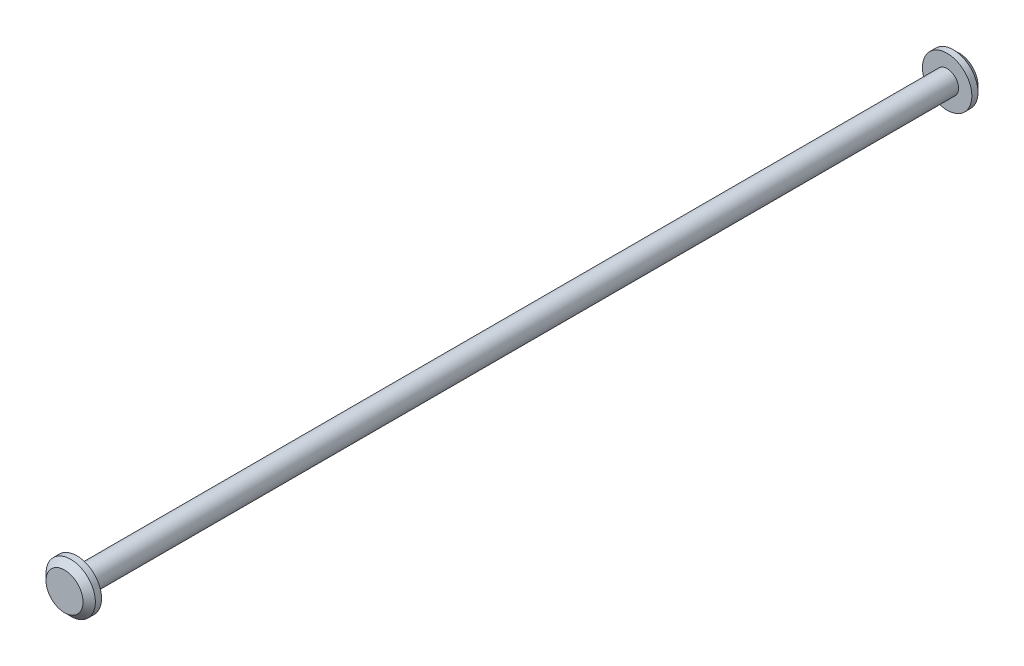
ISO-10303-21;
HEADER;
FILE_DESCRIPTION(('STEP AP214'),'2;1');
FILE_NAME('part.step','',(''),(''),'','','');
FILE_SCHEMA(('AUTOMOTIVE_DESIGN { 1 0 10303 214 1 1 1 1 }'));
ENDSEC;
DATA;
#1=APPLICATION_CONTEXT('core data for automotive mechanical design processes');
#2=APPLICATION_PROTOCOL_DEFINITION('international standard','automotive_design',2000,#1);
#3=PRODUCT_CONTEXT('',#1,'mechanical');
#4=PRODUCT('Part','Part','',(#3));
#5=PRODUCT_RELATED_PRODUCT_CATEGORY('part','',(#4));
#6=PRODUCT_DEFINITION_FORMATION('','',#4);
#7=PRODUCT_DEFINITION_CONTEXT('part definition',#1,'design');
#8=PRODUCT_DEFINITION('design','',#6,#7);
#9=PRODUCT_DEFINITION_SHAPE('','',#8);
#10=(LENGTH_UNIT() NAMED_UNIT(*) SI_UNIT(.MILLI.,.METRE.));
#11=(NAMED_UNIT(*) PLANE_ANGLE_UNIT() SI_UNIT($,.RADIAN.));
#12=(NAMED_UNIT(*) SI_UNIT($,.STERADIAN.) SOLID_ANGLE_UNIT());
#13=UNCERTAINTY_MEASURE_WITH_UNIT(LENGTH_MEASURE(1.E-05),#10,'distance_accuracy_value','');
#14=(GEOMETRIC_REPRESENTATION_CONTEXT(3) GLOBAL_UNCERTAINTY_ASSIGNED_CONTEXT((#13)) GLOBAL_UNIT_ASSIGNED_CONTEXT((#10,
#11,#12)) REPRESENTATION_CONTEXT('',''));
#15=CARTESIAN_POINT('',(0.,0.,0.));
#16=DIRECTION('',(0.,0.,1.));
#17=DIRECTION('',(1.,0.,0.));
#18=AXIS2_PLACEMENT_3D('',#15,#16,#17);
#19=CARTESIAN_POINT('',(0.,0.,70.5));
#20=DIRECTION('',(0.,0.,-1.));
#21=DIRECTION('',(-1.,0.,0.));
#22=AXIS2_PLACEMENT_3D('',#19,#20,#21);
#23=CYLINDRICAL_SURFACE('',#22,0.925);
#24=CARTESIAN_POINT('',(0.,0.,70.5));
#25=DIRECTION('',(0.,0.,1.));
#26=DIRECTION('',(1.,0.,0.));
#27=AXIS2_PLACEMENT_3D('',#24,#25,#26);
#28=CIRCLE('',#27,0.925);
#29=CARTESIAN_POINT('',(0.925,0.,70.5));
#30=VERTEX_POINT('',#29);
#31=EDGE_CURVE('E50',#30,#30,#28,.T.);
#32=ORIENTED_EDGE('',*,*,#31,.F.);
#33=EDGE_LOOP('',(#32));
#34=FACE_BOUND('',#33,.T.);
#35=CARTESIAN_POINT('',(0.,0.,0.));
#36=DIRECTION('',(0.,0.,1.));
#37=DIRECTION('',(1.,0.,0.));
#38=AXIS2_PLACEMENT_3D('',#35,#36,#37);
#39=CIRCLE('',#38,0.925);
#40=CARTESIAN_POINT('',(0.925,0.,0.));
#41=VERTEX_POINT('',#40);
#42=EDGE_CURVE('E51',#41,#41,#39,.T.);
#43=ORIENTED_EDGE('',*,*,#42,.T.);
#44=EDGE_LOOP('',(#43));
#45=FACE_BOUND('',#44,.T.);
#46=ADVANCED_FACE('F30',(#34,#45),#23,.T.);
#47=CARTESIAN_POINT('',(0.,0.,71.5));
#48=DIRECTION('',(0.,0.,-1.));
#49=DIRECTION('',(-1.,0.,0.));
#50=AXIS2_PLACEMENT_3D('',#47,#48,#49);
#51=CYLINDRICAL_SURFACE('',#50,2.);
#52=CARTESIAN_POINT('',(0.,0.,71.));
#53=DIRECTION('',(0.,0.,1.));
#54=DIRECTION('',(1.,0.,0.));
#55=AXIS2_PLACEMENT_3D('',#52,#53,#54);
#56=CIRCLE('',#55,2.);
#57=CARTESIAN_POINT('',(2.,0.,71.));
#58=VERTEX_POINT('',#57);
#59=EDGE_CURVE('E41',#58,#58,#56,.F.);
#60=ORIENTED_EDGE('',*,*,#59,.T.);
#61=EDGE_LOOP('',(#60));
#62=FACE_BOUND('',#61,.T.);
#63=CARTESIAN_POINT('',(0.,0.,70.5));
#64=DIRECTION('',(0.,0.,1.));
#65=DIRECTION('',(1.,0.,0.));
#66=AXIS2_PLACEMENT_3D('',#63,#64,#65);
#67=CIRCLE('',#66,2.);
#68=CARTESIAN_POINT('',(2.,0.,70.5));
#69=VERTEX_POINT('',#68);
#70=EDGE_CURVE('E54',#69,#69,#67,.T.);
#71=ORIENTED_EDGE('',*,*,#70,.T.);
#72=EDGE_LOOP('',(#71));
#73=FACE_BOUND('',#72,.T.);
#74=ADVANCED_FACE('F80',(#62,#73),#51,.T.);
#75=CARTESIAN_POINT('',(0.,0.,71.5));
#76=DIRECTION('',(0.,0.,1.));
#77=DIRECTION('',(1.,0.,0.));
#78=AXIS2_PLACEMENT_3D('',#75,#76,#77);
#79=PLANE('',#78);
#80=CARTESIAN_POINT('',(0.,0.,71.5));
#81=DIRECTION('',(0.,0.,1.));
#82=DIRECTION('',(1.,0.,0.));
#83=AXIS2_PLACEMENT_3D('',#80,#81,#82);
#84=CIRCLE('',#83,1.5);
#85=CARTESIAN_POINT('',(1.5,0.,71.5));
#86=VERTEX_POINT('',#85);
#87=EDGE_CURVE('E45',#86,#86,#84,.T.);
#88=ORIENTED_EDGE('',*,*,#87,.T.);
#89=EDGE_LOOP('',(#88));
#90=FACE_BOUND('',#89,.T.);
#91=ADVANCED_FACE('F86',(#90),#79,.T.);
#92=CARTESIAN_POINT('',(0.,0.,70.5));
#93=DIRECTION('',(0.,0.,1.));
#94=DIRECTION('',(1.,0.,0.));
#95=AXIS2_PLACEMENT_3D('',#92,#93,#94);
#96=PLANE('',#95);
#97=ORIENTED_EDGE('',*,*,#31,.T.);
#98=EDGE_LOOP('',(#97));
#99=FACE_BOUND('',#98,.T.);
#100=ORIENTED_EDGE('',*,*,#70,.F.);
#101=EDGE_LOOP('',(#100));
#102=FACE_BOUND('',#101,.T.);
#103=ADVANCED_FACE('F92',(#99,#102),#96,.F.);
#104=CARTESIAN_POINT('',(0.,0.,-1.));
#105=DIRECTION('',(0.,0.,1.));
#106=DIRECTION('',(1.,0.,0.));
#107=AXIS2_PLACEMENT_3D('',#104,#105,#106);
#108=CYLINDRICAL_SURFACE('',#107,2.);
#109=CARTESIAN_POINT('',(0.,0.,-0.499999999999994));
#110=DIRECTION('',(0.,0.,-1.));
#111=DIRECTION('',(-1.,0.,0.));
#112=AXIS2_PLACEMENT_3D('',#109,#110,#111);
#113=CIRCLE('',#112,2.);
#114=CARTESIAN_POINT('',(-2.,0.,-0.499999999999994));
#115=VERTEX_POINT('',#114);
#116=EDGE_CURVE('E10',#115,#115,#113,.F.);
#117=ORIENTED_EDGE('',*,*,#116,.T.);
#118=EDGE_LOOP('',(#117));
#119=FACE_BOUND('',#118,.T.);
#120=CARTESIAN_POINT('',(0.,0.,0.));
#121=DIRECTION('',(0.,0.,-1.));
#122=DIRECTION('',(-1.,0.,0.));
#123=AXIS2_PLACEMENT_3D('',#120,#121,#122);
#124=CIRCLE('',#123,2.);
#125=CARTESIAN_POINT('',(-2.,0.,0.));
#126=VERTEX_POINT('',#125);
#127=EDGE_CURVE('E55',#126,#126,#124,.T.);
#128=ORIENTED_EDGE('',*,*,#127,.T.);
#129=EDGE_LOOP('',(#128));
#130=FACE_BOUND('',#129,.T.);
#131=ADVANCED_FACE('F63',(#119,#130),#108,.T.);
#132=CARTESIAN_POINT('',(0.,0.,-1.));
#133=DIRECTION('',(0.,0.,-1.));
#134=DIRECTION('',(-1.,0.,0.));
#135=AXIS2_PLACEMENT_3D('',#132,#133,#134);
#136=PLANE('',#135);
#137=CARTESIAN_POINT('',(0.,0.,-1.));
#138=DIRECTION('',(0.,0.,-1.));
#139=DIRECTION('',(-1.,0.,0.));
#140=AXIS2_PLACEMENT_3D('',#137,#138,#139);
#141=CIRCLE('',#140,1.5);
#142=CARTESIAN_POINT('',(-1.5,0.,-1.));
#143=VERTEX_POINT('',#142);
#144=EDGE_CURVE('E37',#143,#143,#141,.T.);
#145=ORIENTED_EDGE('',*,*,#144,.T.);
#146=EDGE_LOOP('',(#145));
#147=FACE_BOUND('',#146,.T.);
#148=ADVANCED_FACE('F68',(#147),#136,.T.);
#149=CARTESIAN_POINT('',(0.,0.,0.));
#150=DIRECTION('',(0.,0.,-1.));
#151=DIRECTION('',(-1.,0.,0.));
#152=AXIS2_PLACEMENT_3D('',#149,#150,#151);
#153=PLANE('',#152);
#154=ORIENTED_EDGE('',*,*,#42,.F.);
#155=EDGE_LOOP('',(#154));
#156=FACE_BOUND('',#155,.T.);
#157=ORIENTED_EDGE('',*,*,#127,.F.);
#158=EDGE_LOOP('',(#157));
#159=FACE_BOUND('',#158,.T.);
#160=ADVANCED_FACE('F65',(#156,#159),#153,.F.);
#161=CARTESIAN_POINT('',(0.,0.,71.5));
#162=DIRECTION('',(0.,0.,-1.));
#163=DIRECTION('',(-1.,0.,0.));
#164=AXIS2_PLACEMENT_3D('',#161,#162,#163);
#165=CONICAL_SURFACE('',#164,1.5,0.785398163397447);
#166=ORIENTED_EDGE('',*,*,#59,.F.);
#167=EDGE_LOOP('',(#166));
#168=FACE_BOUND('',#167,.T.);
#169=ORIENTED_EDGE('',*,*,#87,.F.);
#170=EDGE_LOOP('',(#169));
#171=FACE_BOUND('',#170,.T.);
#172=ADVANCED_FACE('F67',(#168,#171),#165,.T.);
#173=CARTESIAN_POINT('',(0.,0.,-1.));
#174=DIRECTION('',(0.,0.,1.));
#175=DIRECTION('',(1.,0.,0.));
#176=AXIS2_PLACEMENT_3D('',#173,#174,#175);
#177=CONICAL_SURFACE('',#176,1.5,0.785398163397441);
#178=ORIENTED_EDGE('',*,*,#116,.F.);
#179=EDGE_LOOP('',(#178));
#180=FACE_BOUND('',#179,.T.);
#181=ORIENTED_EDGE('',*,*,#144,.F.);
#182=EDGE_LOOP('',(#181));
#183=FACE_BOUND('',#182,.T.);
#184=ADVANCED_FACE('F32',(#180,#183),#177,.T.);
#185=CLOSED_SHELL('',(#46,#74,#91,#103,#131,#148,#160,#172,#184));
#186=MANIFOLD_SOLID_BREP('B2',#185);
#187=ADVANCED_BREP_SHAPE_REPRESENTATION('',(#18,#186),#14);
#188=SHAPE_DEFINITION_REPRESENTATION(#9,#187);
ENDSEC;
END-ISO-10303-21;
